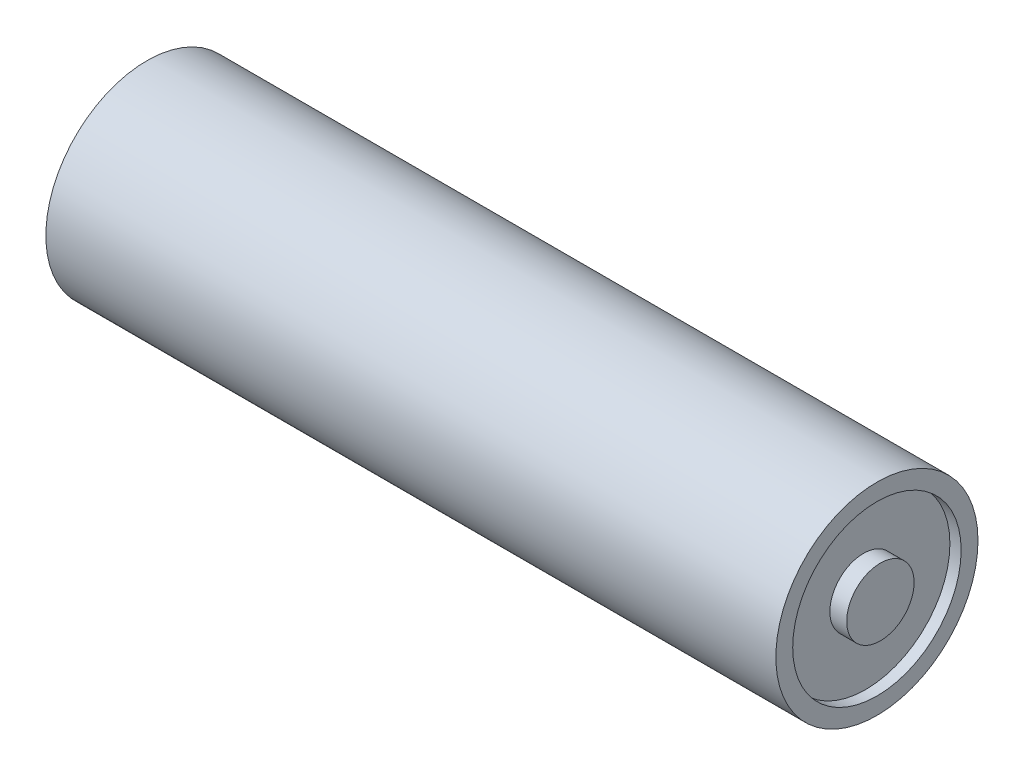
ISO-10303-21;
HEADER;
FILE_DESCRIPTION(('STEP AP214'),'2;1');
FILE_NAME('part.step','',(''),(''),'','','');
FILE_SCHEMA(('AUTOMOTIVE_DESIGN { 1 0 10303 214 1 1 1 1 }'));
ENDSEC;
DATA;
#1=APPLICATION_CONTEXT('core data for automotive mechanical design processes');
#2=APPLICATION_PROTOCOL_DEFINITION('international standard','automotive_design',2000,#1);
#3=PRODUCT_CONTEXT('',#1,'mechanical');
#4=PRODUCT('Part','Part','',(#3));
#5=PRODUCT_RELATED_PRODUCT_CATEGORY('part','',(#4));
#6=PRODUCT_DEFINITION_FORMATION('','',#4);
#7=PRODUCT_DEFINITION_CONTEXT('part definition',#1,'design');
#8=PRODUCT_DEFINITION('design','',#6,#7);
#9=PRODUCT_DEFINITION_SHAPE('','',#8);
#10=(LENGTH_UNIT() NAMED_UNIT(*) SI_UNIT(.MILLI.,.METRE.));
#11=(NAMED_UNIT(*) PLANE_ANGLE_UNIT() SI_UNIT($,.RADIAN.));
#12=(NAMED_UNIT(*) SI_UNIT($,.STERADIAN.) SOLID_ANGLE_UNIT());
#13=UNCERTAINTY_MEASURE_WITH_UNIT(LENGTH_MEASURE(1.E-05),#10,'distance_accuracy_value','');
#14=(GEOMETRIC_REPRESENTATION_CONTEXT(3) GLOBAL_UNCERTAINTY_ASSIGNED_CONTEXT((#13)) GLOBAL_UNIT_ASSIGNED_CONTEXT((#10,
#11,#12)) REPRESENTATION_CONTEXT('',''));
#15=CARTESIAN_POINT('',(0.,0.,0.));
#16=DIRECTION('',(0.,0.,1.));
#17=DIRECTION('',(1.,0.,0.));
#18=AXIS2_PLACEMENT_3D('',#15,#16,#17);
#19=CARTESIAN_POINT('',(65.,0.,0.));
#20=DIRECTION('',(-1.,0.,0.));
#21=DIRECTION('',(0.,0.,1.));
#22=AXIS2_PLACEMENT_3D('',#19,#20,#21);
#23=CYLINDRICAL_SURFACE('',#22,9.);
#24=CARTESIAN_POINT('',(65.,0.,0.));
#25=DIRECTION('',(1.,0.,0.));
#26=DIRECTION('',(0.,0.,-1.));
#27=AXIS2_PLACEMENT_3D('',#24,#25,#26);
#28=CIRCLE('',#27,9.);
#29=CARTESIAN_POINT('',(65.,0.,-9.));
#30=VERTEX_POINT('',#29);
#31=EDGE_CURVE('E10',#30,#30,#28,.T.);
#32=ORIENTED_EDGE('',*,*,#31,.F.);
#33=EDGE_LOOP('',(#32));
#34=FACE_BOUND('',#33,.T.);
#35=CARTESIAN_POINT('',(0.,0.,0.));
#36=DIRECTION('',(1.,0.,0.));
#37=DIRECTION('',(0.,0.,-1.));
#38=AXIS2_PLACEMENT_3D('',#35,#36,#37);
#39=CIRCLE('',#38,9.);
#40=CARTESIAN_POINT('',(0.,0.,-9.));
#41=VERTEX_POINT('',#40);
#42=EDGE_CURVE('E35',#41,#41,#39,.T.);
#43=ORIENTED_EDGE('',*,*,#42,.T.);
#44=EDGE_LOOP('',(#43));
#45=FACE_BOUND('',#44,.T.);
#46=ADVANCED_FACE('F32',(#34,#45),#23,.T.);
#47=CARTESIAN_POINT('',(65.,0.,0.));
#48=DIRECTION('',(1.,0.,0.));
#49=DIRECTION('',(0.,0.,-1.));
#50=AXIS2_PLACEMENT_3D('',#47,#48,#49);
#51=PLANE('',#50);
#52=CARTESIAN_POINT('',(65.,0.,0.));
#53=DIRECTION('',(1.,0.,0.));
#54=DIRECTION('',(0.,0.,-1.));
#55=AXIS2_PLACEMENT_3D('',#52,#53,#54);
#56=CIRCLE('',#55,7.5);
#57=CARTESIAN_POINT('',(65.,0.,-7.5));
#58=VERTEX_POINT('',#57);
#59=EDGE_CURVE('E44',#58,#58,#56,.T.);
#60=ORIENTED_EDGE('',*,*,#59,.F.);
#61=EDGE_LOOP('',(#60));
#62=FACE_BOUND('',#61,.T.);
#63=ORIENTED_EDGE('',*,*,#31,.T.);
#64=EDGE_LOOP('',(#63));
#65=FACE_BOUND('',#64,.T.);
#66=ADVANCED_FACE('F77',(#62,#65),#51,.T.);
#67=CARTESIAN_POINT('',(0.,0.,0.));
#68=DIRECTION('',(1.,0.,0.));
#69=DIRECTION('',(0.,0.,-1.));
#70=AXIS2_PLACEMENT_3D('',#67,#68,#69);
#71=PLANE('',#70);
#72=ORIENTED_EDGE('',*,*,#42,.F.);
#73=EDGE_LOOP('',(#72));
#74=FACE_BOUND('',#73,.T.);
#75=ADVANCED_FACE('F73',(#74),#71,.F.);
#76=CARTESIAN_POINT('',(64.,0.,0.));
#77=DIRECTION('',(1.,0.,0.));
#78=DIRECTION('',(0.,0.,-1.));
#79=AXIS2_PLACEMENT_3D('',#76,#77,#78);
#80=CYLINDRICAL_SURFACE('',#79,7.5);
#81=CARTESIAN_POINT('',(64.,0.,0.));
#82=DIRECTION('',(1.,0.,0.));
#83=DIRECTION('',(0.,0.,-1.));
#84=AXIS2_PLACEMENT_3D('',#81,#82,#83);
#85=CIRCLE('',#84,7.5);
#86=CARTESIAN_POINT('',(64.,0.,-7.5));
#87=VERTEX_POINT('',#86);
#88=EDGE_CURVE('E42',#87,#87,#85,.T.);
#89=ORIENTED_EDGE('',*,*,#88,.F.);
#90=EDGE_LOOP('',(#89));
#91=FACE_BOUND('',#90,.T.);
#92=ORIENTED_EDGE('',*,*,#59,.T.);
#93=EDGE_LOOP('',(#92));
#94=FACE_BOUND('',#93,.T.);
#95=ADVANCED_FACE('F67',(#91,#94),#80,.F.);
#96=CARTESIAN_POINT('',(64.,0.,0.));
#97=DIRECTION('',(1.,0.,0.));
#98=DIRECTION('',(0.,0.,-1.));
#99=AXIS2_PLACEMENT_3D('',#96,#97,#98);
#100=PLANE('',#99);
#101=CARTESIAN_POINT('',(64.,0.103684867838183,0.192251795226639));
#102=DIRECTION('',(1.,0.,0.));
#103=DIRECTION('',(0.,0.,-1.));
#104=AXIS2_PLACEMENT_3D('',#101,#102,#103);
#105=CIRCLE('',#104,3.);
#106=CARTESIAN_POINT('',(64.,0.103684867838183,-2.80774820477336));
#107=VERTEX_POINT('',#106);
#108=EDGE_CURVE('E50',#107,#107,#105,.T.);
#109=ORIENTED_EDGE('',*,*,#108,.F.);
#110=EDGE_LOOP('',(#109));
#111=FACE_BOUND('',#110,.T.);
#112=ORIENTED_EDGE('',*,*,#88,.T.);
#113=EDGE_LOOP('',(#112));
#114=FACE_BOUND('',#113,.T.);
#115=ADVANCED_FACE('F61',(#111,#114),#100,.T.);
#116=CARTESIAN_POINT('',(65.5,0.103684867838183,0.192251795226639));
#117=DIRECTION('',(-1.,0.,0.));
#118=DIRECTION('',(0.,0.,1.));
#119=AXIS2_PLACEMENT_3D('',#116,#117,#118);
#120=CYLINDRICAL_SURFACE('',#119,3.);
#121=CARTESIAN_POINT('',(65.5,0.103684867838183,0.192251795226639));
#122=DIRECTION('',(1.,0.,0.));
#123=DIRECTION('',(0.,0.,-1.));
#124=AXIS2_PLACEMENT_3D('',#121,#122,#123);
#125=CIRCLE('',#124,3.);
#126=CARTESIAN_POINT('',(65.5,0.103684867838183,-2.80774820477336));
#127=VERTEX_POINT('',#126);
#128=EDGE_CURVE('E47',#127,#127,#125,.T.);
#129=ORIENTED_EDGE('',*,*,#128,.F.);
#130=EDGE_LOOP('',(#129));
#131=FACE_BOUND('',#130,.T.);
#132=ORIENTED_EDGE('',*,*,#108,.T.);
#133=EDGE_LOOP('',(#132));
#134=FACE_BOUND('',#133,.T.);
#135=ADVANCED_FACE('F58',(#131,#134),#120,.T.);
#136=CARTESIAN_POINT('',(65.5,0.103684867838183,0.192251795226639));
#137=DIRECTION('',(1.,0.,0.));
#138=DIRECTION('',(0.,0.,-1.));
#139=AXIS2_PLACEMENT_3D('',#136,#137,#138);
#140=PLANE('',#139);
#141=ORIENTED_EDGE('',*,*,#128,.T.);
#142=EDGE_LOOP('',(#141));
#143=FACE_BOUND('',#142,.T.);
#144=ADVANCED_FACE('F56',(#143),#140,.T.);
#145=CLOSED_SHELL('',(#46,#66,#75,#95,#115,#135,#144));
#146=MANIFOLD_SOLID_BREP('B2',#145);
#147=ADVANCED_BREP_SHAPE_REPRESENTATION('',(#18,#146),#14);
#148=SHAPE_DEFINITION_REPRESENTATION(#9,#147);
ENDSEC;
END-ISO-10303-21;
